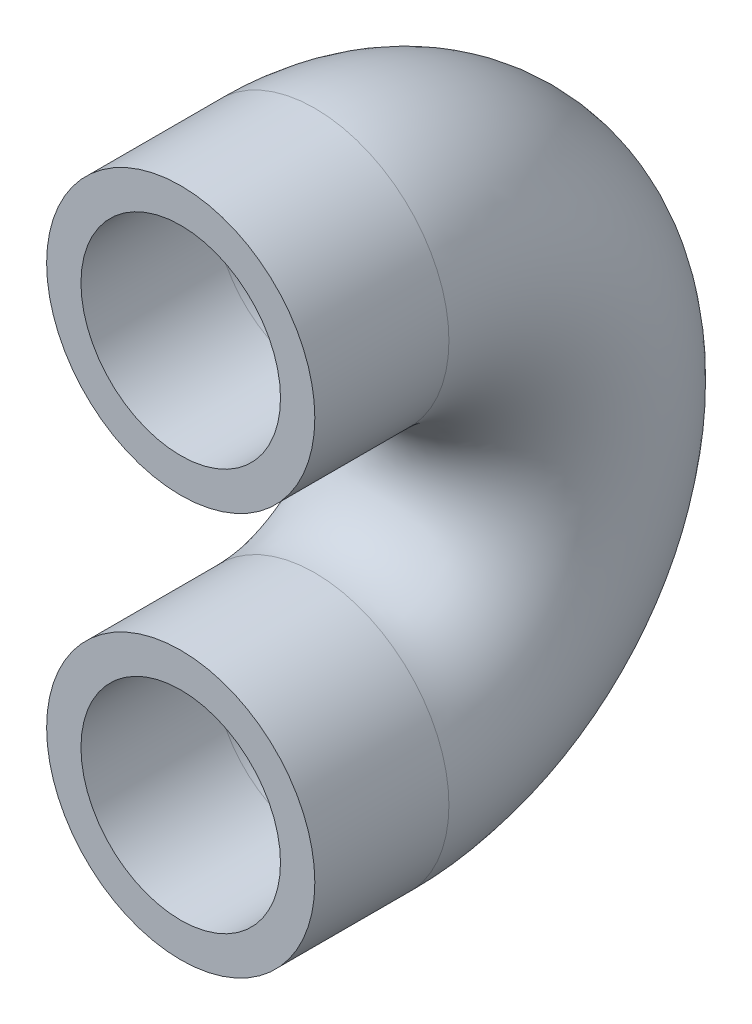
ISO-10303-21;
HEADER;
FILE_DESCRIPTION(('STEP AP214'),'2;1');
FILE_NAME('part.step','',(''),(''),'','','');
FILE_SCHEMA(('AUTOMOTIVE_DESIGN { 1 0 10303 214 1 1 1 1 }'));
ENDSEC;
DATA;
#1=APPLICATION_CONTEXT('core data for automotive mechanical design processes');
#2=APPLICATION_PROTOCOL_DEFINITION('international standard','automotive_design',2000,#1);
#3=PRODUCT_CONTEXT('',#1,'mechanical');
#4=PRODUCT('Part','Part','',(#3));
#5=PRODUCT_RELATED_PRODUCT_CATEGORY('part','',(#4));
#6=PRODUCT_DEFINITION_FORMATION('','',#4);
#7=PRODUCT_DEFINITION_CONTEXT('part definition',#1,'design');
#8=PRODUCT_DEFINITION('design','',#6,#7);
#9=PRODUCT_DEFINITION_SHAPE('','',#8);
#10=(LENGTH_UNIT() NAMED_UNIT(*) SI_UNIT(.MILLI.,.METRE.));
#11=(NAMED_UNIT(*) PLANE_ANGLE_UNIT() SI_UNIT($,.RADIAN.));
#12=(NAMED_UNIT(*) SI_UNIT($,.STERADIAN.) SOLID_ANGLE_UNIT());
#13=UNCERTAINTY_MEASURE_WITH_UNIT(LENGTH_MEASURE(1.E-05),#10,'distance_accuracy_value','');
#14=(GEOMETRIC_REPRESENTATION_CONTEXT(3) GLOBAL_UNCERTAINTY_ASSIGNED_CONTEXT((#13)) GLOBAL_UNIT_ASSIGNED_CONTEXT((#10,
#11,#12)) REPRESENTATION_CONTEXT('',''));
#15=CARTESIAN_POINT('',(0.,0.,0.));
#16=DIRECTION('',(0.,0.,1.));
#17=DIRECTION('',(1.,0.,0.));
#18=AXIS2_PLACEMENT_3D('',#15,#16,#17);
#19=CARTESIAN_POINT('',(-4.76250000000001,13.335,3.175));
#20=DIRECTION('',(0.,0.,1.));
#21=DIRECTION('',(1.,0.,0.));
#22=AXIS2_PLACEMENT_3D('',#19,#20,#21);
#23=PLANE('',#22);
#24=CARTESIAN_POINT('',(-4.76250000000001,13.335,3.175));
#25=DIRECTION('',(0.,0.,1.));
#26=DIRECTION('',(1.,0.,0.));
#27=AXIS2_PLACEMENT_3D('',#24,#25,#26);
#28=CIRCLE('',#27,3.175);
#29=CARTESIAN_POINT('',(-1.58750000000001,13.335,3.175));
#30=VERTEX_POINT('',#29);
#31=EDGE_CURVE('E10',#30,#30,#28,.T.);
#32=ORIENTED_EDGE('',*,*,#31,.T.);
#33=EDGE_LOOP('',(#32));
#34=FACE_BOUND('',#33,.T.);
#35=CARTESIAN_POINT('',(-4.76250000000001,13.335,3.175));
#36=DIRECTION('',(0.,0.,1.));
#37=DIRECTION('',(1.,0.,0.));
#38=AXIS2_PLACEMENT_3D('',#35,#36,#37);
#39=CIRCLE('',#38,2.3622);
#40=CARTESIAN_POINT('',(-2.40030000000001,13.335,3.175));
#41=VERTEX_POINT('',#40);
#42=EDGE_CURVE('E44',#41,#41,#39,.T.);
#43=ORIENTED_EDGE('',*,*,#42,.F.);
#44=EDGE_LOOP('',(#43));
#45=FACE_BOUND('',#44,.T.);
#46=ADVANCED_FACE('F33',(#34,#45),#23,.T.);
#47=CARTESIAN_POINT('',(-4.76250000000001,13.335,3.175));
#48=DIRECTION('',(0.,0.,-1.));
#49=DIRECTION('',(-1.,0.,0.));
#50=AXIS2_PLACEMENT_3D('',#47,#48,#49);
#51=CYLINDRICAL_SURFACE('',#50,3.175);
#52=ORIENTED_EDGE('',*,*,#31,.F.);
#53=EDGE_LOOP('',(#52));
#54=FACE_BOUND('',#53,.T.);
#55=CARTESIAN_POINT('',(-4.76250000000001,13.335,0.));
#56=DIRECTION('',(0.,0.,1.));
#57=DIRECTION('',(1.,0.,0.));
#58=AXIS2_PLACEMENT_3D('',#55,#56,#57);
#59=CIRCLE('',#58,3.175);
#60=CARTESIAN_POINT('',(-4.76250000000001,16.51,0.));
#61=VERTEX_POINT('',#60);
#62=EDGE_CURVE('E37',#61,#61,#59,.T.);
#63=ORIENTED_EDGE('',*,*,#62,.T.);
#64=EDGE_LOOP('',(#63));
#65=FACE_BOUND('',#64,.T.);
#66=ADVANCED_FACE('F35',(#54,#65),#51,.T.);
#67=CARTESIAN_POINT('',(-4.76250000000001,13.335,3.175));
#68=DIRECTION('',(0.,0.,-1.));
#69=DIRECTION('',(-1.,0.,0.));
#70=AXIS2_PLACEMENT_3D('',#67,#68,#69);
#71=CYLINDRICAL_SURFACE('',#70,2.3622);
#72=ORIENTED_EDGE('',*,*,#42,.T.);
#73=EDGE_LOOP('',(#72));
#74=FACE_BOUND('',#73,.T.);
#75=CARTESIAN_POINT('',(-4.76250000000001,13.335,0.));
#76=DIRECTION('',(0.,0.,1.));
#77=DIRECTION('',(1.,0.,0.));
#78=AXIS2_PLACEMENT_3D('',#75,#76,#77);
#79=CIRCLE('',#78,2.3622);
#80=CARTESIAN_POINT('',(-4.76250000000001,15.6972,0.));
#81=VERTEX_POINT('',#80);
#82=EDGE_CURVE('E46',#81,#81,#79,.T.);
#83=ORIENTED_EDGE('',*,*,#82,.F.);
#84=EDGE_LOOP('',(#83));
#85=FACE_BOUND('',#84,.T.);
#86=ADVANCED_FACE('F87',(#74,#85),#71,.F.);
#87=CARTESIAN_POINT('',(-4.76250000000001,8.5725,0.));
#88=DIRECTION('',(1.,0.,0.));
#89=DIRECTION('',(0.,1.,0.));
#90=AXIS2_PLACEMENT_3D('',#87,#88,#89);
#91=TOROIDAL_SURFACE('',#90,4.7625,2.3622);
#92=CARTESIAN_POINT('',(-4.76250000000001,3.81,0.));
#93=DIRECTION('',(0.,0.,1.));
#94=DIRECTION('',(-1.,0.,0.));
#95=AXIS2_PLACEMENT_3D('',#92,#93,#94);
#96=CIRCLE('',#95,2.3622);
#97=CARTESIAN_POINT('',(-4.76250000000001,1.4478,0.));
#98=VERTEX_POINT('',#97);
#99=EDGE_CURVE('E54',#98,#98,#96,.F.);
#100=CARTESIAN_POINT('',(-4.76250000000001,8.5725,0.));
#101=DIRECTION('',(1.,0.,0.));
#102=DIRECTION('',(0.,1.,0.));
#103=AXIS2_PLACEMENT_3D('',#100,#101,#102);
#104=CIRCLE('',#103,7.1247);
#105=EDGE_CURVE('',#98,#81,#104,.T.);
#106=ORIENTED_EDGE('',*,*,#99,.F.);
#107=ORIENTED_EDGE('',*,*,#82,.T.);
#108=ORIENTED_EDGE('',*,*,#105,.T.);
#109=ORIENTED_EDGE('',*,*,#105,.F.);
#110=EDGE_LOOP('',(#106,#108,#107,#109));
#111=FACE_BOUND('',#110,.T.);
#112=ADVANCED_FACE('F79',(#111),#91,.F.);
#113=CARTESIAN_POINT('',(-4.76250000000001,8.5725,0.));
#114=DIRECTION('',(1.,0.,0.));
#115=DIRECTION('',(0.,1.,0.));
#116=AXIS2_PLACEMENT_3D('',#113,#114,#115);
#117=TOROIDAL_SURFACE('',#116,4.7625,3.175);
#118=CARTESIAN_POINT('',(-4.76250000000001,3.81,0.));
#119=DIRECTION('',(0.,0.,1.));
#120=DIRECTION('',(-1.,0.,0.));
#121=AXIS2_PLACEMENT_3D('',#118,#119,#120);
#122=CIRCLE('',#121,3.175);
#123=CARTESIAN_POINT('',(-4.76250000000001,0.634999999999997,0.));
#124=VERTEX_POINT('',#123);
#125=EDGE_CURVE('E49',#124,#124,#122,.T.);
#126=CARTESIAN_POINT('',(-4.76250000000001,8.5725,0.));
#127=DIRECTION('',(1.,0.,0.));
#128=DIRECTION('',(0.,1.,0.));
#129=AXIS2_PLACEMENT_3D('',#126,#127,#128);
#130=CIRCLE('',#129,7.9375);
#131=EDGE_CURVE('',#124,#61,#130,.T.);
#132=ORIENTED_EDGE('',*,*,#125,.F.);
#133=ORIENTED_EDGE('',*,*,#62,.F.);
#134=ORIENTED_EDGE('',*,*,#131,.T.);
#135=ORIENTED_EDGE('',*,*,#131,.F.);
#136=EDGE_LOOP('',(#132,#134,#133,#135));
#137=FACE_BOUND('',#136,.T.);
#138=ADVANCED_FACE('F70',(#137),#117,.T.);
#139=CARTESIAN_POINT('',(-4.7624999999999,3.81,3.175));
#140=DIRECTION('',(0.,0.,1.));
#141=DIRECTION('',(1.,0.,0.));
#142=AXIS2_PLACEMENT_3D('',#139,#140,#141);
#143=PLANE('',#142);
#144=CARTESIAN_POINT('',(-4.7624999999999,3.81,3.175));
#145=DIRECTION('',(0.,0.,1.));
#146=DIRECTION('',(1.,0.,0.));
#147=AXIS2_PLACEMENT_3D('',#144,#145,#146);
#148=CIRCLE('',#147,3.175);
#149=CARTESIAN_POINT('',(-1.5874999999999,3.81,3.175));
#150=VERTEX_POINT('',#149);
#151=EDGE_CURVE('E57',#150,#150,#148,.T.);
#152=ORIENTED_EDGE('',*,*,#151,.T.);
#153=EDGE_LOOP('',(#152));
#154=FACE_BOUND('',#153,.T.);
#155=CARTESIAN_POINT('',(-4.7624999999999,3.81,3.175));
#156=DIRECTION('',(0.,0.,1.));
#157=DIRECTION('',(1.,0.,0.));
#158=AXIS2_PLACEMENT_3D('',#155,#156,#157);
#159=CIRCLE('',#158,2.3622);
#160=CARTESIAN_POINT('',(-2.4002999999999,3.81,3.175));
#161=VERTEX_POINT('',#160);
#162=EDGE_CURVE('E60',#161,#161,#159,.T.);
#163=ORIENTED_EDGE('',*,*,#162,.F.);
#164=EDGE_LOOP('',(#163));
#165=FACE_BOUND('',#164,.T.);
#166=ADVANCED_FACE('F67',(#154,#165),#143,.T.);
#167=CARTESIAN_POINT('',(-4.7624999999999,3.81,3.175));
#168=DIRECTION('',(0.,0.,-1.));
#169=DIRECTION('',(-1.,0.,0.));
#170=AXIS2_PLACEMENT_3D('',#167,#168,#169);
#171=CYLINDRICAL_SURFACE('',#170,3.175);
#172=ORIENTED_EDGE('',*,*,#151,.F.);
#173=EDGE_LOOP('',(#172));
#174=FACE_BOUND('',#173,.T.);
#175=ORIENTED_EDGE('',*,*,#125,.T.);
#176=EDGE_LOOP('',(#175));
#177=FACE_BOUND('',#176,.T.);
#178=ADVANCED_FACE('F69',(#174,#177),#171,.T.);
#179=CARTESIAN_POINT('',(-4.7624999999999,3.81,3.175));
#180=DIRECTION('',(0.,0.,-1.));
#181=DIRECTION('',(-1.,0.,0.));
#182=AXIS2_PLACEMENT_3D('',#179,#180,#181);
#183=CYLINDRICAL_SURFACE('',#182,2.3622);
#184=ORIENTED_EDGE('',*,*,#162,.T.);
#185=EDGE_LOOP('',(#184));
#186=FACE_BOUND('',#185,.T.);
#187=ORIENTED_EDGE('',*,*,#99,.T.);
#188=EDGE_LOOP('',(#187));
#189=FACE_BOUND('',#188,.T.);
#190=ADVANCED_FACE('F64',(#186,#189),#183,.F.);
#191=CLOSED_SHELL('',(#46,#66,#86,#112,#138,#166,#178,#190));
#192=MANIFOLD_SOLID_BREP('B2',#191);
#193=ADVANCED_BREP_SHAPE_REPRESENTATION('',(#18,#192),#14);
#194=SHAPE_DEFINITION_REPRESENTATION(#9,#193);
ENDSEC;
END-ISO-10303-21;
